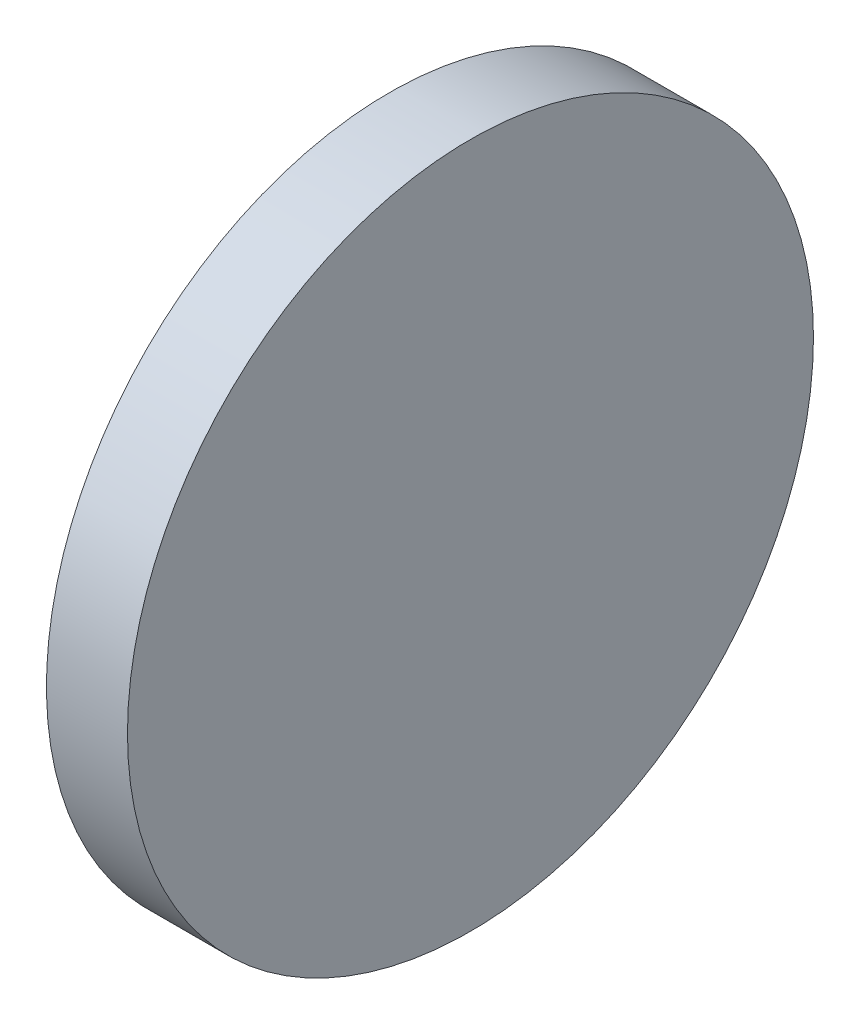
ISO-10303-21;
HEADER;
FILE_DESCRIPTION(('STEP AP214'),'2;1');
FILE_NAME('part.step','',(''),(''),'','','');
FILE_SCHEMA(('AUTOMOTIVE_DESIGN { 1 0 10303 214 1 1 1 1 }'));
ENDSEC;
DATA;
#1=APPLICATION_CONTEXT('core data for automotive mechanical design processes');
#2=APPLICATION_PROTOCOL_DEFINITION('international standard','automotive_design',2000,#1);
#3=PRODUCT_CONTEXT('',#1,'mechanical');
#4=PRODUCT('Part','Part','',(#3));
#5=PRODUCT_RELATED_PRODUCT_CATEGORY('part','',(#4));
#6=PRODUCT_DEFINITION_FORMATION('','',#4);
#7=PRODUCT_DEFINITION_CONTEXT('part definition',#1,'design');
#8=PRODUCT_DEFINITION('design','',#6,#7);
#9=PRODUCT_DEFINITION_SHAPE('','',#8);
#10=(LENGTH_UNIT() NAMED_UNIT(*) SI_UNIT(.MILLI.,.METRE.));
#11=(NAMED_UNIT(*) PLANE_ANGLE_UNIT() SI_UNIT($,.RADIAN.));
#12=(NAMED_UNIT(*) SI_UNIT($,.STERADIAN.) SOLID_ANGLE_UNIT());
#13=UNCERTAINTY_MEASURE_WITH_UNIT(LENGTH_MEASURE(1.E-05),#10,'distance_accuracy_value','');
#14=(GEOMETRIC_REPRESENTATION_CONTEXT(3) GLOBAL_UNCERTAINTY_ASSIGNED_CONTEXT((#13)) GLOBAL_UNIT_ASSIGNED_CONTEXT((#10,
#11,#12)) REPRESENTATION_CONTEXT('',''));
#15=CARTESIAN_POINT('',(0.,0.,0.));
#16=DIRECTION('',(0.,0.,1.));
#17=DIRECTION('',(1.,0.,0.));
#18=AXIS2_PLACEMENT_3D('',#15,#16,#17);
#19=CARTESIAN_POINT('',(23.7238578680203,12.7,0.));
#20=DIRECTION('',(1.,0.,0.));
#21=DIRECTION('',(0.,0.,-1.));
#22=AXIS2_PLACEMENT_3D('',#19,#20,#21);
#23=CYLINDRICAL_SURFACE('',#22,12.7);
#24=CARTESIAN_POINT('',(0.,12.7,0.));
#25=DIRECTION('',(1.,0.,0.));
#26=DIRECTION('',(0.,0.,-1.));
#27=AXIS2_PLACEMENT_3D('',#24,#25,#26);
#28=CIRCLE('',#27,12.7);
#29=CARTESIAN_POINT('',(0.,12.7,-12.7));
#30=VERTEX_POINT('',#29);
#31=EDGE_CURVE('E44',#30,#30,#28,.T.);
#32=ORIENTED_EDGE('',*,*,#31,.F.);
#33=EDGE_LOOP('',(#32));
#34=FACE_BOUND('',#33,.T.);
#35=CARTESIAN_POINT('',(-3.00000000000001,12.7,0.));
#36=DIRECTION('',(1.,0.,0.));
#37=DIRECTION('',(0.,0.,-1.));
#38=AXIS2_PLACEMENT_3D('',#35,#36,#37);
#39=CIRCLE('',#38,12.7);
#40=CARTESIAN_POINT('',(-3.00000000000001,12.7,-12.7));
#41=VERTEX_POINT('',#40);
#42=EDGE_CURVE('E10',#41,#41,#39,.T.);
#43=ORIENTED_EDGE('',*,*,#42,.T.);
#44=EDGE_LOOP('',(#43));
#45=FACE_BOUND('',#44,.T.);
#46=ADVANCED_FACE('F37',(#34,#45),#23,.T.);
#47=CARTESIAN_POINT('',(58.3846153846153,12.7,0.));
#48=DIRECTION('',(1.,0.,0.));
#49=DIRECTION('',(0.,-1.,0.));
#50=AXIS2_PLACEMENT_3D('',#47,#48,#49);
#51=SPHERICAL_SURFACE('',#50,62.6846153846153);
#52=ORIENTED_EDGE('',*,*,#42,.F.);
#53=EDGE_LOOP('',(#52));
#54=FACE_BOUND('',#53,.T.);
#55=ADVANCED_FACE('F54',(#54),#51,.T.);
#56=CARTESIAN_POINT('',(0.,0.,0.));
#57=DIRECTION('',(-1.,0.,0.));
#58=DIRECTION('',(0.,0.,1.));
#59=AXIS2_PLACEMENT_3D('',#56,#57,#58);
#60=PLANE('',#59);
#61=ORIENTED_EDGE('',*,*,#31,.T.);
#62=EDGE_LOOP('',(#61));
#63=FACE_BOUND('',#62,.T.);
#64=ADVANCED_FACE('F51',(#63),#60,.F.);
#65=CLOSED_SHELL('',(#46,#55,#64));
#66=MANIFOLD_SOLID_BREP('B2',#65);
#67=ADVANCED_BREP_SHAPE_REPRESENTATION('',(#18,#66),#14);
#68=SHAPE_DEFINITION_REPRESENTATION(#9,#67);
ENDSEC;
END-ISO-10303-21;
